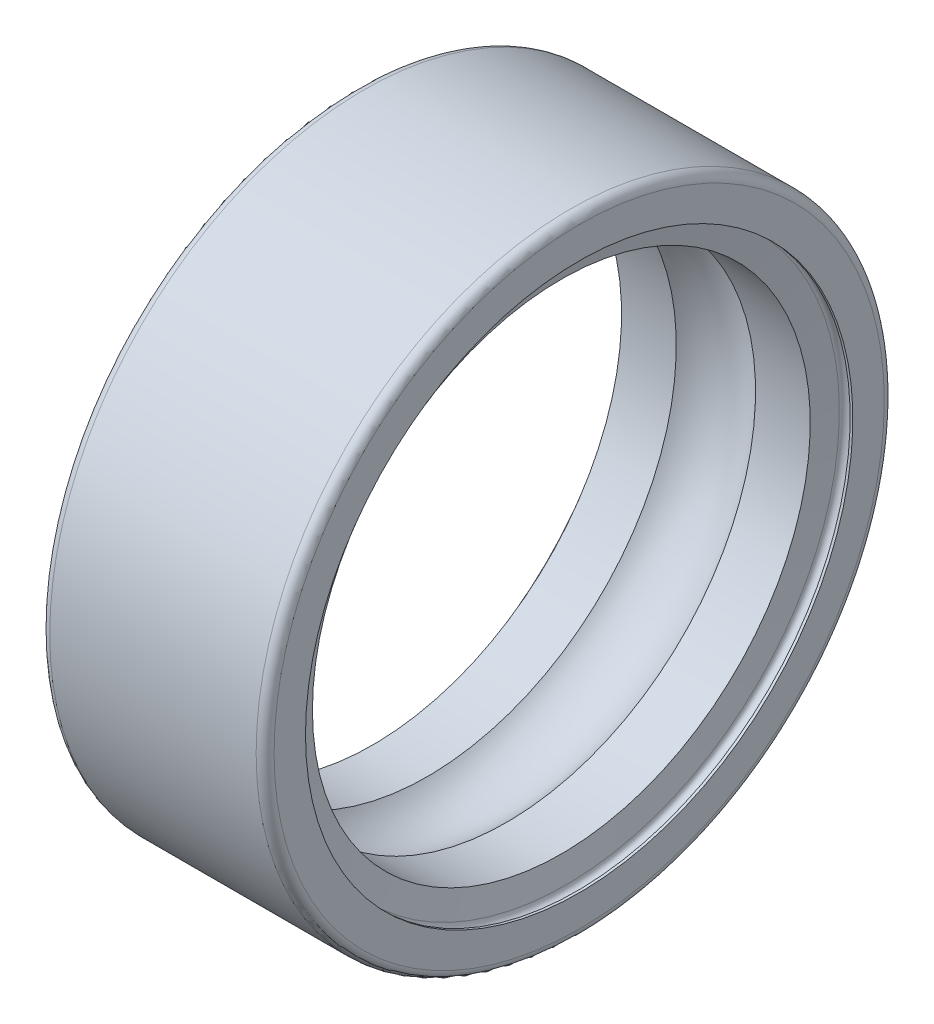
ISO-10303-21;
HEADER;
FILE_DESCRIPTION(('STEP AP214'),'2;1');
FILE_NAME('part.step','',(''),(''),'','','');
FILE_SCHEMA(('AUTOMOTIVE_DESIGN { 1 0 10303 214 1 1 1 1 }'));
ENDSEC;
DATA;
#1=APPLICATION_CONTEXT('core data for automotive mechanical design processes');
#2=APPLICATION_PROTOCOL_DEFINITION('international standard','automotive_design',2000,#1);
#3=PRODUCT_CONTEXT('',#1,'mechanical');
#4=PRODUCT('Part','Part','',(#3));
#5=PRODUCT_RELATED_PRODUCT_CATEGORY('part','',(#4));
#6=PRODUCT_DEFINITION_FORMATION('','',#4);
#7=PRODUCT_DEFINITION_CONTEXT('part definition',#1,'design');
#8=PRODUCT_DEFINITION('design','',#6,#7);
#9=PRODUCT_DEFINITION_SHAPE('','',#8);
#10=(LENGTH_UNIT() NAMED_UNIT(*) SI_UNIT(.MILLI.,.METRE.));
#11=(NAMED_UNIT(*) PLANE_ANGLE_UNIT() SI_UNIT($,.RADIAN.));
#12=(NAMED_UNIT(*) SI_UNIT($,.STERADIAN.) SOLID_ANGLE_UNIT());
#13=UNCERTAINTY_MEASURE_WITH_UNIT(LENGTH_MEASURE(1.E-05),#10,'distance_accuracy_value','');
#14=(GEOMETRIC_REPRESENTATION_CONTEXT(3) GLOBAL_UNCERTAINTY_ASSIGNED_CONTEXT((#13)) GLOBAL_UNIT_ASSIGNED_CONTEXT((#10,
#11,#12)) REPRESENTATION_CONTEXT('',''));
#15=CARTESIAN_POINT('',(0.,0.,0.));
#16=DIRECTION('',(0.,0.,1.));
#17=DIRECTION('',(1.,0.,0.));
#18=AXIS2_PLACEMENT_3D('',#15,#16,#17);
#19=CARTESIAN_POINT('',(0.200000000000017,0.,0.));
#20=DIRECTION('',(-1.,0.,0.));
#21=DIRECTION('',(0.,0.,1.));
#22=AXIS2_PLACEMENT_3D('',#19,#20,#21);
#23=TOROIDAL_SURFACE('',#22,6.79999999999998,0.200000000000017);
#24=CARTESIAN_POINT('',(0.,0.,0.));
#25=DIRECTION('',(-1.,0.,0.));
#26=DIRECTION('',(0.,0.,1.));
#27=AXIS2_PLACEMENT_3D('',#24,#25,#26);
#28=CIRCLE('',#27,6.8);
#29=CARTESIAN_POINT('',(0.,0.,6.8));
#30=VERTEX_POINT('',#29);
#31=EDGE_CURVE('E10',#30,#30,#28,.T.);
#32=ORIENTED_EDGE('',*,*,#31,.F.);
#33=EDGE_LOOP('',(#32));
#34=FACE_BOUND('',#33,.T.);
#35=CARTESIAN_POINT('',(0.199999999999999,0.,0.));
#36=DIRECTION('',(-1.,0.,0.));
#37=DIRECTION('',(0.,0.,1.));
#38=AXIS2_PLACEMENT_3D('',#35,#36,#37);
#39=CIRCLE('',#38,7.);
#40=CARTESIAN_POINT('',(0.199999999999999,0.,7.));
#41=VERTEX_POINT('',#40);
#42=EDGE_CURVE('E77',#41,#41,#39,.T.);
#43=ORIENTED_EDGE('',*,*,#42,.T.);
#44=EDGE_LOOP('',(#43));
#45=FACE_BOUND('',#44,.T.);
#46=ADVANCED_FACE('F31',(#34,#45),#23,.T.);
#47=CARTESIAN_POINT('',(0.,6.8,0.));
#48=DIRECTION('',(1.,0.,0.));
#49=DIRECTION('',(0.,0.,-1.));
#50=AXIS2_PLACEMENT_3D('',#47,#48,#49);
#51=PLANE('',#50);
#52=CARTESIAN_POINT('',(0.,0.,0.));
#53=DIRECTION('',(-1.,0.,0.));
#54=DIRECTION('',(0.,0.,1.));
#55=AXIS2_PLACEMENT_3D('',#52,#53,#54);
#56=CIRCLE('',#55,6.1);
#57=CARTESIAN_POINT('',(0.,0.,6.1));
#58=VERTEX_POINT('',#57);
#59=EDGE_CURVE('E37',#58,#58,#56,.T.);
#60=ORIENTED_EDGE('',*,*,#59,.F.);
#61=EDGE_LOOP('',(#60));
#62=FACE_BOUND('',#61,.T.);
#63=ORIENTED_EDGE('',*,*,#31,.T.);
#64=EDGE_LOOP('',(#63));
#65=FACE_BOUND('',#64,.T.);
#66=ADVANCED_FACE('F150',(#62,#65),#51,.F.);
#67=CARTESIAN_POINT('',(50.,0.,0.));
#68=DIRECTION('',(-1.,0.,0.));
#69=DIRECTION('',(0.,0.,1.));
#70=AXIS2_PLACEMENT_3D('',#67,#68,#69);
#71=CYLINDRICAL_SURFACE('',#70,6.1);
#72=CARTESIAN_POINT('',(0.0599999999999976,0.,0.));
#73=DIRECTION('',(-1.,0.,0.));
#74=DIRECTION('',(0.,0.,1.));
#75=AXIS2_PLACEMENT_3D('',#72,#73,#74);
#76=CIRCLE('',#75,6.1);
#77=CARTESIAN_POINT('',(0.0599999999999976,0.,6.1));
#78=VERTEX_POINT('',#77);
#79=EDGE_CURVE('E41',#78,#78,#76,.T.);
#80=ORIENTED_EDGE('',*,*,#79,.F.);
#81=EDGE_LOOP('',(#80));
#82=FACE_BOUND('',#81,.T.);
#83=ORIENTED_EDGE('',*,*,#59,.T.);
#84=EDGE_LOOP('',(#83));
#85=FACE_BOUND('',#84,.T.);
#86=ADVANCED_FACE('F145',(#82,#85),#71,.F.);
#87=CARTESIAN_POINT('',(0.18,0.,0.));
#88=DIRECTION('',(-1.,0.,0.));
#89=DIRECTION('',(0.,0.,1.));
#90=AXIS2_PLACEMENT_3D('',#87,#88,#89);
#91=TOROIDAL_SURFACE('',#90,6.1,0.12);
#92=CARTESIAN_POINT('',(0.300000000000002,0.,0.));
#93=DIRECTION('',(-1.,0.,0.));
#94=DIRECTION('',(0.,0.,1.));
#95=AXIS2_PLACEMENT_3D('',#92,#93,#94);
#96=CIRCLE('',#95,6.1);
#97=CARTESIAN_POINT('',(0.300000000000002,0.,6.1));
#98=VERTEX_POINT('',#97);
#99=EDGE_CURVE('E45',#98,#98,#96,.T.);
#100=ORIENTED_EDGE('',*,*,#99,.F.);
#101=EDGE_LOOP('',(#100));
#102=FACE_BOUND('',#101,.T.);
#103=ORIENTED_EDGE('',*,*,#79,.T.);
#104=EDGE_LOOP('',(#103));
#105=FACE_BOUND('',#104,.T.);
#106=ADVANCED_FACE('F139',(#102,#105),#91,.F.);
#107=CARTESIAN_POINT('',(0.300000000000002,0.,0.));
#108=DIRECTION('',(-1.,0.,0.));
#109=DIRECTION('',(0.,0.,1.));
#110=AXIS2_PLACEMENT_3D('',#107,#108,#109);
#111=CONICAL_SURFACE('',#110,6.1,1.39626340159547);
#112=CARTESIAN_POINT('',(0.397332493351069,0.,0.));
#113=DIRECTION('',(-1.,0.,0.));
#114=DIRECTION('',(0.,0.,1.));
#115=AXIS2_PLACEMENT_3D('',#112,#113,#114);
#116=CIRCLE('',#115,5.548);
#117=CARTESIAN_POINT('',(0.397332493351069,0.,5.548));
#118=VERTEX_POINT('',#117);
#119=EDGE_CURVE('E50',#118,#118,#116,.T.);
#120=ORIENTED_EDGE('',*,*,#119,.F.);
#121=EDGE_LOOP('',(#120));
#122=FACE_BOUND('',#121,.T.);
#123=ORIENTED_EDGE('',*,*,#99,.T.);
#124=EDGE_LOOP('',(#123));
#125=FACE_BOUND('',#124,.T.);
#126=ADVANCED_FACE('F133',(#122,#125),#111,.F.);
#127=CARTESIAN_POINT('',(50.,0.,0.));
#128=DIRECTION('',(-1.,0.,0.));
#129=DIRECTION('',(0.,0.,1.));
#130=AXIS2_PLACEMENT_3D('',#127,#128,#129);
#131=CYLINDRICAL_SURFACE('',#130,5.548);
#132=CARTESIAN_POINT('',(1.6165486714029,0.,0.));
#133=DIRECTION('',(-1.,0.,0.));
#134=DIRECTION('',(0.,0.,1.));
#135=AXIS2_PLACEMENT_3D('',#132,#133,#134);
#136=CIRCLE('',#135,5.548);
#137=CARTESIAN_POINT('',(1.6165486714029,0.,5.548));
#138=VERTEX_POINT('',#137);
#139=EDGE_CURVE('E53',#138,#138,#136,.T.);
#140=ORIENTED_EDGE('',*,*,#139,.F.);
#141=EDGE_LOOP('',(#140));
#142=FACE_BOUND('',#141,.T.);
#143=ORIENTED_EDGE('',*,*,#119,.T.);
#144=EDGE_LOOP('',(#143));
#145=FACE_BOUND('',#144,.T.);
#146=ADVANCED_FACE('F127',(#142,#145),#131,.F.);
#147=CARTESIAN_POINT('',(2.5,0.,0.));
#148=DIRECTION('',(-1.,0.,0.));
#149=DIRECTION('',(0.,0.,1.));
#150=AXIS2_PLACEMENT_3D('',#147,#148,#149);
#151=TOROIDAL_SURFACE('',#150,4.75000000000002,1.19049999999998);
#152=CARTESIAN_POINT('',(3.3834513285971,0.,0.));
#153=DIRECTION('',(-1.,0.,0.));
#154=DIRECTION('',(0.,0.,1.));
#155=AXIS2_PLACEMENT_3D('',#152,#153,#154);
#156=CIRCLE('',#155,5.548);
#157=CARTESIAN_POINT('',(3.3834513285971,0.,5.548));
#158=VERTEX_POINT('',#157);
#159=EDGE_CURVE('E56',#158,#158,#156,.T.);
#160=ORIENTED_EDGE('',*,*,#159,.F.);
#161=EDGE_LOOP('',(#160));
#162=FACE_BOUND('',#161,.T.);
#163=ORIENTED_EDGE('',*,*,#139,.T.);
#164=EDGE_LOOP('',(#163));
#165=FACE_BOUND('',#164,.T.);
#166=ADVANCED_FACE('F121',(#162,#165),#151,.F.);
#167=CARTESIAN_POINT('',(50.,0.,0.));
#168=DIRECTION('',(-1.,0.,0.));
#169=DIRECTION('',(0.,0.,1.));
#170=AXIS2_PLACEMENT_3D('',#167,#168,#169);
#171=CYLINDRICAL_SURFACE('',#170,5.548);
#172=CARTESIAN_POINT('',(4.6026675066489,0.,0.));
#173=DIRECTION('',(-1.,0.,0.));
#174=DIRECTION('',(0.,0.,1.));
#175=AXIS2_PLACEMENT_3D('',#172,#173,#174);
#176=CIRCLE('',#175,5.548);
#177=CARTESIAN_POINT('',(4.6026675066489,0.,5.548));
#178=VERTEX_POINT('',#177);
#179=EDGE_CURVE('E59',#178,#178,#176,.T.);
#180=ORIENTED_EDGE('',*,*,#179,.F.);
#181=EDGE_LOOP('',(#180));
#182=FACE_BOUND('',#181,.T.);
#183=ORIENTED_EDGE('',*,*,#159,.T.);
#184=EDGE_LOOP('',(#183));
#185=FACE_BOUND('',#184,.T.);
#186=ADVANCED_FACE('F115',(#182,#185),#171,.F.);
#187=CARTESIAN_POINT('',(4.6026675066489,0.,0.));
#188=DIRECTION('',(1.,0.,0.));
#189=DIRECTION('',(0.,0.,-1.));
#190=AXIS2_PLACEMENT_3D('',#187,#188,#189);
#191=CONICAL_SURFACE('',#190,5.548,1.39626340159541);
#192=CARTESIAN_POINT('',(4.7,0.,0.));
#193=DIRECTION('',(-1.,0.,0.));
#194=DIRECTION('',(0.,0.,1.));
#195=AXIS2_PLACEMENT_3D('',#192,#193,#194);
#196=CIRCLE('',#195,6.1);
#197=CARTESIAN_POINT('',(4.7,0.,6.1));
#198=VERTEX_POINT('',#197);
#199=EDGE_CURVE('E62',#198,#198,#196,.T.);
#200=ORIENTED_EDGE('',*,*,#199,.F.);
#201=EDGE_LOOP('',(#200));
#202=FACE_BOUND('',#201,.T.);
#203=ORIENTED_EDGE('',*,*,#179,.T.);
#204=EDGE_LOOP('',(#203));
#205=FACE_BOUND('',#204,.T.);
#206=ADVANCED_FACE('F109',(#202,#205),#191,.F.);
#207=CARTESIAN_POINT('',(4.82,0.,0.));
#208=DIRECTION('',(-1.,0.,0.));
#209=DIRECTION('',(0.,0.,1.));
#210=AXIS2_PLACEMENT_3D('',#207,#208,#209);
#211=TOROIDAL_SURFACE('',#210,6.1,0.12);
#212=CARTESIAN_POINT('',(4.94,0.,0.));
#213=DIRECTION('',(-1.,0.,0.));
#214=DIRECTION('',(0.,0.,1.));
#215=AXIS2_PLACEMENT_3D('',#212,#213,#214);
#216=CIRCLE('',#215,6.1);
#217=CARTESIAN_POINT('',(4.94,0.,6.1));
#218=VERTEX_POINT('',#217);
#219=EDGE_CURVE('E65',#218,#218,#216,.T.);
#220=ORIENTED_EDGE('',*,*,#219,.F.);
#221=EDGE_LOOP('',(#220));
#222=FACE_BOUND('',#221,.T.);
#223=ORIENTED_EDGE('',*,*,#199,.T.);
#224=EDGE_LOOP('',(#223));
#225=FACE_BOUND('',#224,.T.);
#226=ADVANCED_FACE('F103',(#222,#225),#211,.F.);
#227=CARTESIAN_POINT('',(50.,0.,0.));
#228=DIRECTION('',(-1.,0.,0.));
#229=DIRECTION('',(0.,0.,1.));
#230=AXIS2_PLACEMENT_3D('',#227,#228,#229);
#231=CYLINDRICAL_SURFACE('',#230,6.1);
#232=CARTESIAN_POINT('',(5.,0.,0.));
#233=DIRECTION('',(-1.,0.,0.));
#234=DIRECTION('',(0.,0.,1.));
#235=AXIS2_PLACEMENT_3D('',#232,#233,#234);
#236=CIRCLE('',#235,6.1);
#237=CARTESIAN_POINT('',(5.,0.,6.1));
#238=VERTEX_POINT('',#237);
#239=EDGE_CURVE('E68',#238,#238,#236,.T.);
#240=ORIENTED_EDGE('',*,*,#239,.F.);
#241=EDGE_LOOP('',(#240));
#242=FACE_BOUND('',#241,.T.);
#243=ORIENTED_EDGE('',*,*,#219,.T.);
#244=EDGE_LOOP('',(#243));
#245=FACE_BOUND('',#244,.T.);
#246=ADVANCED_FACE('F97',(#242,#245),#231,.F.);
#247=CARTESIAN_POINT('',(5.,6.1,0.));
#248=DIRECTION('',(-1.,0.,0.));
#249=DIRECTION('',(0.,0.,1.));
#250=AXIS2_PLACEMENT_3D('',#247,#248,#249);
#251=PLANE('',#250);
#252=CARTESIAN_POINT('',(5.,0.,0.));
#253=DIRECTION('',(-1.,0.,0.));
#254=DIRECTION('',(0.,0.,1.));
#255=AXIS2_PLACEMENT_3D('',#252,#253,#254);
#256=CIRCLE('',#255,6.8);
#257=CARTESIAN_POINT('',(5.,0.,6.8));
#258=VERTEX_POINT('',#257);
#259=EDGE_CURVE('E71',#258,#258,#256,.T.);
#260=ORIENTED_EDGE('',*,*,#259,.F.);
#261=EDGE_LOOP('',(#260));
#262=FACE_BOUND('',#261,.T.);
#263=ORIENTED_EDGE('',*,*,#239,.T.);
#264=EDGE_LOOP('',(#263));
#265=FACE_BOUND('',#264,.T.);
#266=ADVANCED_FACE('F91',(#262,#265),#251,.F.);
#267=CARTESIAN_POINT('',(4.79999999999997,0.,0.));
#268=DIRECTION('',(-1.,0.,0.));
#269=DIRECTION('',(0.,0.,1.));
#270=AXIS2_PLACEMENT_3D('',#267,#268,#269);
#271=TOROIDAL_SURFACE('',#270,6.79999999999997,0.200000000000033);
#272=CARTESIAN_POINT('',(4.8,0.,0.));
#273=DIRECTION('',(-1.,0.,0.));
#274=DIRECTION('',(0.,0.,1.));
#275=AXIS2_PLACEMENT_3D('',#272,#273,#274);
#276=CIRCLE('',#275,7.);
#277=CARTESIAN_POINT('',(4.8,0.,7.));
#278=VERTEX_POINT('',#277);
#279=EDGE_CURVE('E74',#278,#278,#276,.T.);
#280=ORIENTED_EDGE('',*,*,#279,.F.);
#281=EDGE_LOOP('',(#280));
#282=FACE_BOUND('',#281,.T.);
#283=ORIENTED_EDGE('',*,*,#259,.T.);
#284=EDGE_LOOP('',(#283));
#285=FACE_BOUND('',#284,.T.);
#286=ADVANCED_FACE('F85',(#282,#285),#271,.T.);
#287=CARTESIAN_POINT('',(50.,0.,0.));
#288=DIRECTION('',(-1.,0.,0.));
#289=DIRECTION('',(0.,0.,1.));
#290=AXIS2_PLACEMENT_3D('',#287,#288,#289);
#291=CYLINDRICAL_SURFACE('',#290,7.);
#292=ORIENTED_EDGE('',*,*,#42,.F.);
#293=EDGE_LOOP('',(#292));
#294=FACE_BOUND('',#293,.T.);
#295=ORIENTED_EDGE('',*,*,#279,.T.);
#296=EDGE_LOOP('',(#295));
#297=FACE_BOUND('',#296,.T.);
#298=ADVANCED_FACE('F82',(#294,#297),#291,.T.);
#299=CLOSED_SHELL('',(#46,#66,#86,#106,#126,#146,#166,#186,#206,#226,#246,#266,#286,#298));
#300=MANIFOLD_SOLID_BREP('B2',#299);
#301=ADVANCED_BREP_SHAPE_REPRESENTATION('',(#18,#300),#14);
#302=SHAPE_DEFINITION_REPRESENTATION(#9,#301);
ENDSEC;
END-ISO-10303-21;
